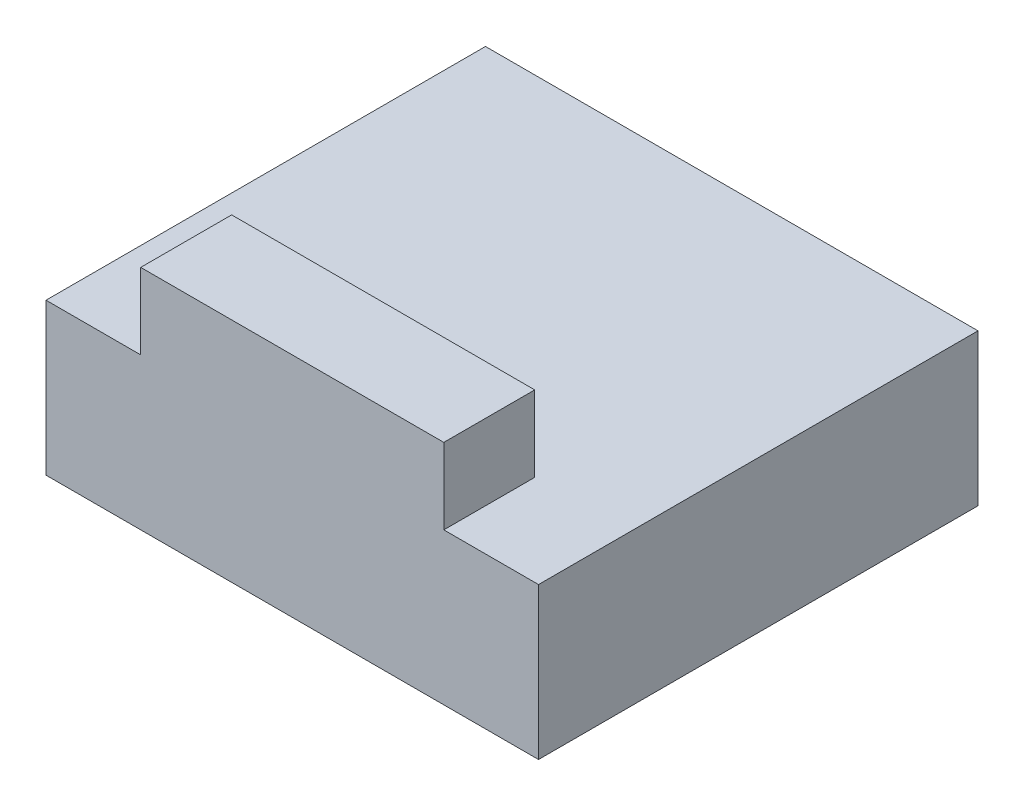
ISO-10303-21;
HEADER;
FILE_DESCRIPTION(('STEP AP214'),'2;1');
FILE_NAME('part.step','',(''),(''),'','','');
FILE_SCHEMA(('AUTOMOTIVE_DESIGN { 1 0 10303 214 1 1 1 1 }'));
ENDSEC;
DATA;
#1=APPLICATION_CONTEXT('core data for automotive mechanical design processes');
#2=APPLICATION_PROTOCOL_DEFINITION('international standard','automotive_design',2000,#1);
#3=PRODUCT_CONTEXT('',#1,'mechanical');
#4=PRODUCT('Part','Part','',(#3));
#5=PRODUCT_RELATED_PRODUCT_CATEGORY('part','',(#4));
#6=PRODUCT_DEFINITION_FORMATION('','',#4);
#7=PRODUCT_DEFINITION_CONTEXT('part definition',#1,'design');
#8=PRODUCT_DEFINITION('design','',#6,#7);
#9=PRODUCT_DEFINITION_SHAPE('','',#8);
#10=(LENGTH_UNIT() NAMED_UNIT(*) SI_UNIT(.MILLI.,.METRE.));
#11=(NAMED_UNIT(*) PLANE_ANGLE_UNIT() SI_UNIT($,.RADIAN.));
#12=(NAMED_UNIT(*) SI_UNIT($,.STERADIAN.) SOLID_ANGLE_UNIT());
#13=UNCERTAINTY_MEASURE_WITH_UNIT(LENGTH_MEASURE(1.E-05),#10,'distance_accuracy_value','');
#14=(GEOMETRIC_REPRESENTATION_CONTEXT(3) GLOBAL_UNCERTAINTY_ASSIGNED_CONTEXT((#13)) GLOBAL_UNIT_ASSIGNED_CONTEXT((#10,
#11,#12)) REPRESENTATION_CONTEXT('',''));
#15=CARTESIAN_POINT('',(0.,0.,0.));
#16=DIRECTION('',(0.,0.,1.));
#17=DIRECTION('',(1.,0.,0.));
#18=AXIS2_PLACEMENT_3D('',#15,#16,#17);
#19=CARTESIAN_POINT('',(-32.5,20.,29.));
#20=DIRECTION('',(1.,0.,0.));
#21=DIRECTION('',(0.,0.,-1.));
#22=AXIS2_PLACEMENT_3D('',#19,#20,#21);
#23=PLANE('',#22);
#24=DIRECTION('',(0.,0.,1.));
#25=VECTOR('',#24,1.);
#26=CARTESIAN_POINT('',(-32.5,0.,29.));
#27=LINE('',#26,#25);
#28=CARTESIAN_POINT('',(-32.5,0.,-29.));
#29=VERTEX_POINT('',#28);
#30=CARTESIAN_POINT('',(-32.5,0.,29.));
#31=VERTEX_POINT('',#30);
#32=EDGE_CURVE('E138',#29,#31,#27,.T.);
#33=ORIENTED_EDGE('',*,*,#32,.T.);
#34=DIRECTION('',(0.,-1.,0.));
#35=VECTOR('',#34,1.);
#36=CARTESIAN_POINT('',(-32.5,20.,29.));
#37=LINE('',#36,#35);
#38=CARTESIAN_POINT('',(-32.5,20.,29.));
#39=VERTEX_POINT('',#38);
#40=EDGE_CURVE('E11',#39,#31,#37,.T.);
#41=ORIENTED_EDGE('',*,*,#40,.F.);
#42=DIRECTION('',(0.,0.,1.));
#43=VECTOR('',#42,1.);
#44=CARTESIAN_POINT('',(-32.5,20.,29.));
#45=LINE('',#44,#43);
#46=CARTESIAN_POINT('',(-32.5,20.,-29.));
#47=VERTEX_POINT('',#46);
#48=EDGE_CURVE('E139',#47,#39,#45,.T.);
#49=ORIENTED_EDGE('',*,*,#48,.F.);
#50=DIRECTION('',(0.,-1.,0.));
#51=VECTOR('',#50,1.);
#52=CARTESIAN_POINT('',(-32.5,20.,-29.));
#53=LINE('',#52,#51);
#54=EDGE_CURVE('E150',#47,#29,#53,.T.);
#55=ORIENTED_EDGE('',*,*,#54,.T.);
#56=EDGE_LOOP('',(#33,#41,#49,#55));
#57=FACE_BOUND('',#56,.T.);
#58=ADVANCED_FACE('F39',(#57),#23,.F.);
#59=CARTESIAN_POINT('',(32.5,20.,29.));
#60=DIRECTION('',(0.,0.,-1.));
#61=DIRECTION('',(-1.,0.,0.));
#62=AXIS2_PLACEMENT_3D('',#59,#60,#61);
#63=PLANE('',#62);
#64=DIRECTION('',(1.,0.,0.));
#65=VECTOR('',#64,1.);
#66=CARTESIAN_POINT('',(32.5,20.,29.));
#67=LINE('',#66,#65);
#68=CARTESIAN_POINT('',(20.,20.,29.));
#69=VERTEX_POINT('',#68);
#70=CARTESIAN_POINT('',(32.5,20.,29.));
#71=VERTEX_POINT('',#70);
#72=EDGE_CURVE('E142',#69,#71,#67,.T.);
#73=ORIENTED_EDGE('',*,*,#72,.F.);
#74=DIRECTION('',(0.,-1.,0.));
#75=VECTOR('',#74,1.);
#76=CARTESIAN_POINT('',(20.,30.,29.));
#77=LINE('',#76,#75);
#78=CARTESIAN_POINT('',(20.,30.,29.));
#79=VERTEX_POINT('',#78);
#80=EDGE_CURVE('E130',#79,#69,#77,.T.);
#81=ORIENTED_EDGE('',*,*,#80,.F.);
#82=DIRECTION('',(-1.,0.,0.));
#83=VECTOR('',#82,1.);
#84=CARTESIAN_POINT('',(-20.,30.,29.));
#85=LINE('',#84,#83);
#86=CARTESIAN_POINT('',(-20.,30.,29.));
#87=VERTEX_POINT('',#86);
#88=EDGE_CURVE('E110',#79,#87,#85,.T.);
#89=ORIENTED_EDGE('',*,*,#88,.T.);
#90=DIRECTION('',(0.,-1.,0.));
#91=VECTOR('',#90,1.);
#92=CARTESIAN_POINT('',(-20.,30.,29.));
#93=LINE('',#92,#91);
#94=CARTESIAN_POINT('',(-20.,20.,29.));
#95=VERTEX_POINT('',#94);
#96=EDGE_CURVE('E124',#87,#95,#93,.T.);
#97=ORIENTED_EDGE('',*,*,#96,.T.);
#98=EDGE_CURVE('E144',#39,#95,#67,.T.);
#99=ORIENTED_EDGE('',*,*,#98,.F.);
#100=ORIENTED_EDGE('',*,*,#40,.T.);
#101=DIRECTION('',(1.,0.,0.));
#102=VECTOR('',#101,1.);
#103=CARTESIAN_POINT('',(32.5,0.,29.));
#104=LINE('',#103,#102);
#105=CARTESIAN_POINT('',(32.5,0.,29.));
#106=VERTEX_POINT('',#105);
#107=EDGE_CURVE('E153',#31,#106,#104,.T.);
#108=ORIENTED_EDGE('',*,*,#107,.T.);
#109=DIRECTION('',(0.,-1.,0.));
#110=VECTOR('',#109,1.);
#111=CARTESIAN_POINT('',(32.5,20.,29.));
#112=LINE('',#111,#110);
#113=EDGE_CURVE('E46',#71,#106,#112,.T.);
#114=ORIENTED_EDGE('',*,*,#113,.F.);
#115=EDGE_LOOP('',(#73,#81,#89,#97,#99,#100,#108,#114));
#116=FACE_BOUND('',#115,.T.);
#117=ADVANCED_FACE('F182',(#116),#63,.F.);
#118=CARTESIAN_POINT('',(32.5,20.,29.));
#119=DIRECTION('',(-1.,0.,0.));
#120=DIRECTION('',(0.,0.,1.));
#121=AXIS2_PLACEMENT_3D('',#118,#119,#120);
#122=PLANE('',#121);
#123=DIRECTION('',(0.,0.,-1.));
#124=VECTOR('',#123,1.);
#125=CARTESIAN_POINT('',(32.5,0.,29.));
#126=LINE('',#125,#124);
#127=CARTESIAN_POINT('',(32.5,0.,-29.));
#128=VERTEX_POINT('',#127);
#129=EDGE_CURVE('E155',#106,#128,#126,.T.);
#130=ORIENTED_EDGE('',*,*,#129,.T.);
#131=DIRECTION('',(0.,-1.,0.));
#132=VECTOR('',#131,1.);
#133=CARTESIAN_POINT('',(32.5,20.,-29.));
#134=LINE('',#133,#132);
#135=CARTESIAN_POINT('',(32.5,20.,-29.));
#136=VERTEX_POINT('',#135);
#137=EDGE_CURVE('E160',#136,#128,#134,.T.);
#138=ORIENTED_EDGE('',*,*,#137,.F.);
#139=DIRECTION('',(0.,0.,-1.));
#140=VECTOR('',#139,1.);
#141=CARTESIAN_POINT('',(32.5,20.,29.));
#142=LINE('',#141,#140);
#143=EDGE_CURVE('E146',#71,#136,#142,.T.);
#144=ORIENTED_EDGE('',*,*,#143,.F.);
#145=ORIENTED_EDGE('',*,*,#113,.T.);
#146=EDGE_LOOP('',(#130,#138,#144,#145));
#147=FACE_BOUND('',#146,.T.);
#148=ADVANCED_FACE('F167',(#147),#122,.F.);
#149=CARTESIAN_POINT('',(32.5,20.,-29.));
#150=DIRECTION('',(0.,0.,1.));
#151=DIRECTION('',(1.,0.,0.));
#152=AXIS2_PLACEMENT_3D('',#149,#150,#151);
#153=PLANE('',#152);
#154=DIRECTION('',(-1.,0.,0.));
#155=VECTOR('',#154,1.);
#156=CARTESIAN_POINT('',(32.5,0.,-29.));
#157=LINE('',#156,#155);
#158=EDGE_CURVE('E143',#128,#29,#157,.T.);
#159=ORIENTED_EDGE('',*,*,#158,.T.);
#160=ORIENTED_EDGE('',*,*,#54,.F.);
#161=DIRECTION('',(-1.,0.,0.));
#162=VECTOR('',#161,1.);
#163=CARTESIAN_POINT('',(32.5,20.,-29.));
#164=LINE('',#163,#162);
#165=EDGE_CURVE('E148',#136,#47,#164,.T.);
#166=ORIENTED_EDGE('',*,*,#165,.F.);
#167=ORIENTED_EDGE('',*,*,#137,.T.);
#168=EDGE_LOOP('',(#159,#160,#166,#167));
#169=FACE_BOUND('',#168,.T.);
#170=ADVANCED_FACE('F176',(#169),#153,.F.);
#171=CARTESIAN_POINT('',(0.,20.,0.));
#172=DIRECTION('',(0.,1.,0.));
#173=DIRECTION('',(0.,0.,1.));
#174=AXIS2_PLACEMENT_3D('',#171,#172,#173);
#175=PLANE('',#174);
#176=DIRECTION('',(0.,0.,1.));
#177=VECTOR('',#176,1.);
#178=CARTESIAN_POINT('',(-20.,20.,0.));
#179=LINE('',#178,#177);
#180=CARTESIAN_POINT('',(-20.,20.,17.));
#181=VERTEX_POINT('',#180);
#182=EDGE_CURVE('E136',#181,#95,#179,.T.);
#183=ORIENTED_EDGE('',*,*,#182,.F.);
#184=DIRECTION('',(-1.,0.,0.));
#185=VECTOR('',#184,1.);
#186=CARTESIAN_POINT('',(0.,20.,17.));
#187=LINE('',#186,#185);
#188=CARTESIAN_POINT('',(20.,20.,17.));
#189=VERTEX_POINT('',#188);
#190=EDGE_CURVE('E53',#189,#181,#187,.T.);
#191=ORIENTED_EDGE('',*,*,#190,.F.);
#192=DIRECTION('',(0.,0.,-1.));
#193=VECTOR('',#192,1.);
#194=CARTESIAN_POINT('',(20.,20.,0.));
#195=LINE('',#194,#193);
#196=EDGE_CURVE('E57',#69,#189,#195,.T.);
#197=ORIENTED_EDGE('',*,*,#196,.F.);
#198=ORIENTED_EDGE('',*,*,#72,.T.);
#199=ORIENTED_EDGE('',*,*,#143,.T.);
#200=ORIENTED_EDGE('',*,*,#165,.T.);
#201=ORIENTED_EDGE('',*,*,#48,.T.);
#202=ORIENTED_EDGE('',*,*,#98,.T.);
#203=EDGE_LOOP('',(#183,#191,#197,#198,#199,#200,#201,#202));
#204=FACE_BOUND('',#203,.T.);
#205=ADVANCED_FACE('F181',(#204),#175,.T.);
#206=CARTESIAN_POINT('',(0.,0.,0.));
#207=DIRECTION('',(0.,1.,0.));
#208=DIRECTION('',(0.,0.,1.));
#209=AXIS2_PLACEMENT_3D('',#206,#207,#208);
#210=PLANE('',#209);
#211=ORIENTED_EDGE('',*,*,#129,.F.);
#212=ORIENTED_EDGE('',*,*,#107,.F.);
#213=ORIENTED_EDGE('',*,*,#32,.F.);
#214=ORIENTED_EDGE('',*,*,#158,.F.);
#215=EDGE_LOOP('',(#211,#212,#213,#214));
#216=FACE_BOUND('',#215,.T.);
#217=ADVANCED_FACE('F172',(#216),#210,.F.);
#218=CARTESIAN_POINT('',(-20.,30.,29.));
#219=DIRECTION('',(-1.,0.,0.));
#220=DIRECTION('',(0.,0.,1.));
#221=AXIS2_PLACEMENT_3D('',#218,#219,#220);
#222=PLANE('',#221);
#223=DIRECTION('',(0.,-1.,0.));
#224=VECTOR('',#223,1.);
#225=CARTESIAN_POINT('',(-20.,30.,17.));
#226=LINE('',#225,#224);
#227=CARTESIAN_POINT('',(-20.,30.,17.));
#228=VERTEX_POINT('',#227);
#229=EDGE_CURVE('E101',#228,#181,#226,.T.);
#230=ORIENTED_EDGE('',*,*,#229,.T.);
#231=ORIENTED_EDGE('',*,*,#182,.T.);
#232=ORIENTED_EDGE('',*,*,#96,.F.);
#233=DIRECTION('',(0.,0.,-1.));
#234=VECTOR('',#233,1.);
#235=CARTESIAN_POINT('',(-20.,30.,29.));
#236=LINE('',#235,#234);
#237=EDGE_CURVE('E117',#87,#228,#236,.T.);
#238=ORIENTED_EDGE('',*,*,#237,.T.);
#239=EDGE_LOOP('',(#230,#231,#232,#238));
#240=FACE_BOUND('',#239,.T.);
#241=ADVANCED_FACE('F122',(#240),#222,.T.);
#242=CARTESIAN_POINT('',(20.,30.,29.));
#243=DIRECTION('',(1.,0.,0.));
#244=DIRECTION('',(0.,0.,-1.));
#245=AXIS2_PLACEMENT_3D('',#242,#243,#244);
#246=PLANE('',#245);
#247=ORIENTED_EDGE('',*,*,#80,.T.);
#248=ORIENTED_EDGE('',*,*,#196,.T.);
#249=DIRECTION('',(0.,-1.,0.));
#250=VECTOR('',#249,1.);
#251=CARTESIAN_POINT('',(20.,30.,17.));
#252=LINE('',#251,#250);
#253=CARTESIAN_POINT('',(20.,30.,17.));
#254=VERTEX_POINT('',#253);
#255=EDGE_CURVE('E109',#254,#189,#252,.T.);
#256=ORIENTED_EDGE('',*,*,#255,.F.);
#257=DIRECTION('',(0.,0.,1.));
#258=VECTOR('',#257,1.);
#259=CARTESIAN_POINT('',(20.,30.,29.));
#260=LINE('',#259,#258);
#261=EDGE_CURVE('E120',#254,#79,#260,.T.);
#262=ORIENTED_EDGE('',*,*,#261,.T.);
#263=EDGE_LOOP('',(#247,#248,#256,#262));
#264=FACE_BOUND('',#263,.T.);
#265=ADVANCED_FACE('F184',(#264),#246,.T.);
#266=CARTESIAN_POINT('',(-20.,30.,17.));
#267=DIRECTION('',(0.,0.,-1.));
#268=DIRECTION('',(-1.,0.,0.));
#269=AXIS2_PLACEMENT_3D('',#266,#267,#268);
#270=PLANE('',#269);
#271=ORIENTED_EDGE('',*,*,#255,.T.);
#272=ORIENTED_EDGE('',*,*,#190,.T.);
#273=ORIENTED_EDGE('',*,*,#229,.F.);
#274=DIRECTION('',(1.,0.,0.));
#275=VECTOR('',#274,1.);
#276=CARTESIAN_POINT('',(-20.,30.,17.));
#277=LINE('',#276,#275);
#278=EDGE_CURVE('E105',#228,#254,#277,.T.);
#279=ORIENTED_EDGE('',*,*,#278,.T.);
#280=EDGE_LOOP('',(#271,#272,#273,#279));
#281=FACE_BOUND('',#280,.T.);
#282=ADVANCED_FACE('F104',(#281),#270,.T.);
#283=CARTESIAN_POINT('',(0.,30.,0.));
#284=DIRECTION('',(0.,-1.,0.));
#285=DIRECTION('',(0.,0.,-1.));
#286=AXIS2_PLACEMENT_3D('',#283,#284,#285);
#287=PLANE('',#286);
#288=ORIENTED_EDGE('',*,*,#237,.F.);
#289=ORIENTED_EDGE('',*,*,#88,.F.);
#290=ORIENTED_EDGE('',*,*,#261,.F.);
#291=ORIENTED_EDGE('',*,*,#278,.F.);
#292=EDGE_LOOP('',(#288,#289,#290,#291));
#293=FACE_BOUND('',#292,.T.);
#294=ADVANCED_FACE('F115',(#293),#287,.F.);
#295=CLOSED_SHELL('',(#58,#117,#148,#170,#205,#217,#241,#265,#282,#294));
#296=MANIFOLD_SOLID_BREP('B2',#295);
#297=ADVANCED_BREP_SHAPE_REPRESENTATION('',(#18,#296),#14);
#298=SHAPE_DEFINITION_REPRESENTATION(#9,#297);
ENDSEC;
END-ISO-10303-21;
